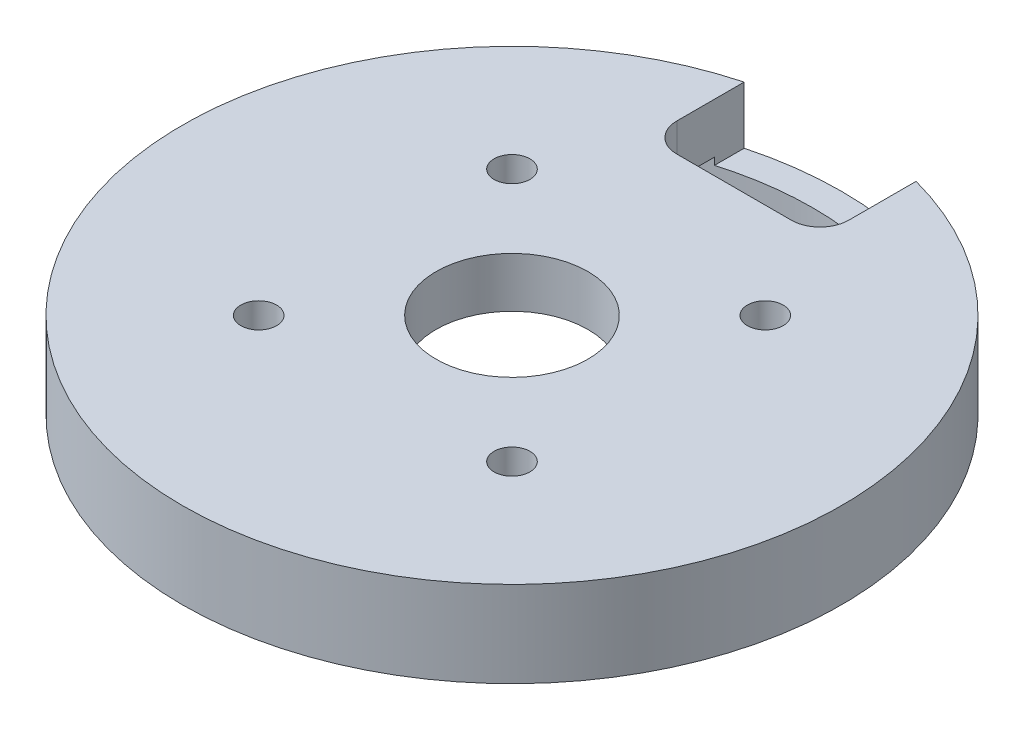
ISO-10303-21;
HEADER;
FILE_DESCRIPTION(('STEP AP214'),'2;1');
FILE_NAME('part.step','',(''),(''),'','','');
FILE_SCHEMA(('AUTOMOTIVE_DESIGN { 1 0 10303 214 1 1 1 1 }'));
ENDSEC;
DATA;
#1=APPLICATION_CONTEXT('core data for automotive mechanical design processes');
#2=APPLICATION_PROTOCOL_DEFINITION('international standard','automotive_design',2000,#1);
#3=PRODUCT_CONTEXT('',#1,'mechanical');
#4=PRODUCT('Part','Part','',(#3));
#5=PRODUCT_RELATED_PRODUCT_CATEGORY('part','',(#4));
#6=PRODUCT_DEFINITION_FORMATION('','',#4);
#7=PRODUCT_DEFINITION_CONTEXT('part definition',#1,'design');
#8=PRODUCT_DEFINITION('design','',#6,#7);
#9=PRODUCT_DEFINITION_SHAPE('','',#8);
#10=(LENGTH_UNIT() NAMED_UNIT(*) SI_UNIT(.MILLI.,.METRE.));
#11=(NAMED_UNIT(*) PLANE_ANGLE_UNIT() SI_UNIT($,.RADIAN.));
#12=(NAMED_UNIT(*) SI_UNIT($,.STERADIAN.) SOLID_ANGLE_UNIT());
#13=UNCERTAINTY_MEASURE_WITH_UNIT(LENGTH_MEASURE(1.E-05),#10,'distance_accuracy_value','');
#14=(GEOMETRIC_REPRESENTATION_CONTEXT(3) GLOBAL_UNCERTAINTY_ASSIGNED_CONTEXT((#13)) GLOBAL_UNIT_ASSIGNED_CONTEXT((#10,
#11,#12)) REPRESENTATION_CONTEXT('',''));
#15=CARTESIAN_POINT('',(0.,0.,0.));
#16=DIRECTION('',(0.,0.,1.));
#17=DIRECTION('',(1.,0.,0.));
#18=AXIS2_PLACEMENT_3D('',#15,#16,#17);
#19=CARTESIAN_POINT('',(0.,6.,0.));
#20=DIRECTION('',(0.,-1.,0.));
#21=DIRECTION('',(0.,0.,-1.));
#22=AXIS2_PLACEMENT_3D('',#19,#20,#21);
#23=CYLINDRICAL_SURFACE('',#22,23.);
#24=CARTESIAN_POINT('',(0.,6.,0.));
#25=DIRECTION('',(0.,1.,0.));
#26=DIRECTION('',(0.,0.,1.));
#27=AXIS2_PLACEMENT_3D('',#24,#25,#26);
#28=CIRCLE('',#27,23.);
#29=CARTESIAN_POINT('',(-6.,6.,-22.2036033111745));
#30=VERTEX_POINT('',#29);
#31=CARTESIAN_POINT('',(6.00000000000001,6.,-22.2036033111745));
#32=VERTEX_POINT('',#31);
#33=EDGE_CURVE('E164',#30,#32,#28,.T.);
#34=ORIENTED_EDGE('',*,*,#33,.F.);
#35=DIRECTION('',(0.,1.,0.));
#36=VECTOR('',#35,1.);
#37=CARTESIAN_POINT('',(-6.,2.,-22.2036033111745));
#38=LINE('',#37,#36);
#39=CARTESIAN_POINT('',(-6.,2.,-22.2036033111745));
#40=VERTEX_POINT('',#39);
#41=EDGE_CURVE('E121',#40,#30,#38,.T.);
#42=ORIENTED_EDGE('',*,*,#41,.F.);
#43=CARTESIAN_POINT('',(0.,2.,0.));
#44=DIRECTION('',(0.,1.,0.));
#45=DIRECTION('',(0.,0.,1.));
#46=AXIS2_PLACEMENT_3D('',#43,#44,#45);
#47=CIRCLE('',#46,23.);
#48=CARTESIAN_POINT('',(6.00000000000001,2.,-22.2036033111745));
#49=VERTEX_POINT('',#48);
#50=EDGE_CURVE('E108',#49,#40,#47,.T.);
#51=ORIENTED_EDGE('',*,*,#50,.F.);
#52=DIRECTION('',(0.,1.,0.));
#53=VECTOR('',#52,1.);
#54=CARTESIAN_POINT('',(6.00000000000001,2.,-22.2036033111745));
#55=LINE('',#54,#53);
#56=EDGE_CURVE('E114',#49,#32,#55,.T.);
#57=ORIENTED_EDGE('',*,*,#56,.T.);
#58=EDGE_LOOP('',(#34,#42,#51,#57));
#59=FACE_BOUND('',#58,.T.);
#60=CARTESIAN_POINT('',(0.,0.,0.));
#61=DIRECTION('',(0.,1.,0.));
#62=DIRECTION('',(0.,0.,1.));
#63=AXIS2_PLACEMENT_3D('',#60,#61,#62);
#64=CIRCLE('',#63,23.);
#65=CARTESIAN_POINT('',(0.,0.,23.));
#66=VERTEX_POINT('',#65);
#67=EDGE_CURVE('E160',#66,#66,#64,.T.);
#68=ORIENTED_EDGE('',*,*,#67,.T.);
#69=EDGE_LOOP('',(#68));
#70=FACE_BOUND('',#69,.T.);
#71=ADVANCED_FACE('F37',(#59,#70),#23,.T.);
#72=CARTESIAN_POINT('',(0.,6.,0.));
#73=DIRECTION('',(0.,1.,0.));
#74=DIRECTION('',(0.,0.,1.));
#75=AXIS2_PLACEMENT_3D('',#72,#73,#74);
#76=PLANE('',#75);
#77=CARTESIAN_POINT('',(-8.83883476483186,6.,-8.83883476483183));
#78=DIRECTION('',(0.,1.,0.));
#79=DIRECTION('',(0.,0.,1.));
#80=AXIS2_PLACEMENT_3D('',#77,#78,#79);
#81=CIRCLE('',#80,1.24999999999999);
#82=CARTESIAN_POINT('',(-8.83883476483186,6.,-7.58883476483184));
#83=VERTEX_POINT('',#82);
#84=EDGE_CURVE('E197',#83,#83,#81,.T.);
#85=ORIENTED_EDGE('',*,*,#84,.F.);
#86=EDGE_LOOP('',(#85));
#87=FACE_BOUND('',#86,.T.);
#88=CARTESIAN_POINT('',(8.83883476483183,6.,-8.83883476483186));
#89=DIRECTION('',(0.,1.,0.));
#90=DIRECTION('',(0.,0.,1.));
#91=AXIS2_PLACEMENT_3D('',#88,#89,#90);
#92=CIRCLE('',#91,1.24999999999999);
#93=CARTESIAN_POINT('',(8.83883476483183,6.,-7.58883476483187));
#94=VERTEX_POINT('',#93);
#95=EDGE_CURVE('E187',#94,#94,#92,.T.);
#96=ORIENTED_EDGE('',*,*,#95,.F.);
#97=EDGE_LOOP('',(#96));
#98=FACE_BOUND('',#97,.T.);
#99=CARTESIAN_POINT('',(8.83883476483186,6.,8.83883476483183));
#100=DIRECTION('',(0.,1.,0.));
#101=DIRECTION('',(0.,0.,1.));
#102=AXIS2_PLACEMENT_3D('',#99,#100,#101);
#103=CIRCLE('',#102,1.24999999999999);
#104=CARTESIAN_POINT('',(8.83883476483186,6.,10.0888347648318));
#105=VERTEX_POINT('',#104);
#106=EDGE_CURVE('E184',#105,#105,#103,.T.);
#107=ORIENTED_EDGE('',*,*,#106,.F.);
#108=EDGE_LOOP('',(#107));
#109=FACE_BOUND('',#108,.T.);
#110=CARTESIAN_POINT('',(-8.83883476483183,6.,8.83883476483186));
#111=DIRECTION('',(0.,1.,0.));
#112=DIRECTION('',(0.,0.,1.));
#113=AXIS2_PLACEMENT_3D('',#110,#111,#112);
#114=CIRCLE('',#113,1.24999999999999);
#115=CARTESIAN_POINT('',(-8.83883476483183,6.,10.0888347648318));
#116=VERTEX_POINT('',#115);
#117=EDGE_CURVE('E181',#116,#116,#114,.T.);
#118=ORIENTED_EDGE('',*,*,#117,.F.);
#119=EDGE_LOOP('',(#118));
#120=FACE_BOUND('',#119,.T.);
#121=DIRECTION('',(0.,0.,1.));
#122=VECTOR('',#121,1.);
#123=CARTESIAN_POINT('',(-6.,6.,-22.2036033111745));
#124=LINE('',#123,#122);
#125=CARTESIAN_POINT('',(-6.,6.,-17.5));
#126=VERTEX_POINT('',#125);
#127=EDGE_CURVE('E133',#30,#126,#124,.T.);
#128=ORIENTED_EDGE('',*,*,#127,.F.);
#129=ORIENTED_EDGE('',*,*,#33,.T.);
#130=DIRECTION('',(0.,0.,-1.));
#131=VECTOR('',#130,1.);
#132=CARTESIAN_POINT('',(6.,6.,-22.2036033111745));
#133=LINE('',#132,#131);
#134=CARTESIAN_POINT('',(6.,6.,-17.5));
#135=VERTEX_POINT('',#134);
#136=EDGE_CURVE('E117',#135,#32,#133,.T.);
#137=ORIENTED_EDGE('',*,*,#136,.F.);
#138=CARTESIAN_POINT('',(4.,6.,-17.5));
#139=DIRECTION('',(0.,1.,0.));
#140=DIRECTION('',(0.,0.,1.));
#141=AXIS2_PLACEMENT_3D('',#138,#139,#140);
#142=CIRCLE('',#141,2.);
#143=CARTESIAN_POINT('',(3.99999999999999,6.,-15.5));
#144=VERTEX_POINT('',#143);
#145=EDGE_CURVE('E53',#144,#135,#142,.T.);
#146=ORIENTED_EDGE('',*,*,#145,.F.);
#147=DIRECTION('',(1.,0.,0.));
#148=VECTOR('',#147,1.);
#149=CARTESIAN_POINT('',(-3.99999999999999,6.,-15.5));
#150=LINE('',#149,#148);
#151=CARTESIAN_POINT('',(-3.99999999999999,6.,-15.5));
#152=VERTEX_POINT('',#151);
#153=EDGE_CURVE('E111',#152,#144,#150,.T.);
#154=ORIENTED_EDGE('',*,*,#153,.F.);
#155=CARTESIAN_POINT('',(-4.,6.,-17.5));
#156=DIRECTION('',(0.,1.,0.));
#157=DIRECTION('',(0.,0.,-1.));
#158=AXIS2_PLACEMENT_3D('',#155,#156,#157);
#159=CIRCLE('',#158,2.);
#160=EDGE_CURVE('E136',#126,#152,#159,.T.);
#161=ORIENTED_EDGE('',*,*,#160,.F.);
#162=EDGE_LOOP('',(#128,#129,#137,#146,#154,#161));
#163=FACE_BOUND('',#162,.T.);
#164=CARTESIAN_POINT('',(0.,6.,0.));
#165=DIRECTION('',(0.,-1.,0.));
#166=DIRECTION('',(0.,0.,-1.));
#167=AXIS2_PLACEMENT_3D('',#164,#165,#166);
#168=CIRCLE('',#167,5.3);
#169=CARTESIAN_POINT('',(0.,6.,-5.3));
#170=VERTEX_POINT('',#169);
#171=EDGE_CURVE('E153',#170,#170,#168,.T.);
#172=ORIENTED_EDGE('',*,*,#171,.T.);
#173=EDGE_LOOP('',(#172));
#174=FACE_BOUND('',#173,.T.);
#175=ADVANCED_FACE('F204',(#87,#98,#109,#120,#163,#174),#76,.T.);
#176=CARTESIAN_POINT('',(0.,0.,0.));
#177=DIRECTION('',(0.,1.,0.));
#178=DIRECTION('',(0.,0.,1.));
#179=AXIS2_PLACEMENT_3D('',#176,#177,#178);
#180=PLANE('',#179);
#181=CARTESIAN_POINT('',(0.,0.,0.));
#182=DIRECTION('',(0.,-1.,0.));
#183=DIRECTION('',(0.,0.,-1.));
#184=AXIS2_PLACEMENT_3D('',#181,#182,#183);
#185=CIRCLE('',#184,21.);
#186=CARTESIAN_POINT('',(0.,0.,-21.));
#187=VERTEX_POINT('',#186);
#188=EDGE_CURVE('E161',#187,#187,#185,.T.);
#189=ORIENTED_EDGE('',*,*,#188,.F.);
#190=EDGE_LOOP('',(#189));
#191=FACE_BOUND('',#190,.T.);
#192=ORIENTED_EDGE('',*,*,#67,.F.);
#193=EDGE_LOOP('',(#192));
#194=FACE_BOUND('',#193,.T.);
#195=ADVANCED_FACE('F207',(#191,#194),#180,.F.);
#196=CARTESIAN_POINT('',(0.,2.5,0.));
#197=DIRECTION('',(0.,-1.,0.));
#198=DIRECTION('',(0.,0.,-1.));
#199=AXIS2_PLACEMENT_3D('',#196,#197,#198);
#200=CYLINDRICAL_SURFACE('',#199,21.);
#201=CARTESIAN_POINT('',(0.,2.,0.));
#202=DIRECTION('',(0.,1.,0.));
#203=DIRECTION('',(0.,0.,1.));
#204=AXIS2_PLACEMENT_3D('',#201,#202,#203);
#205=CIRCLE('',#204,21.);
#206=CARTESIAN_POINT('',(-6.,2.,-20.1246117974981));
#207=VERTEX_POINT('',#206);
#208=CARTESIAN_POINT('',(6.,2.,-20.1246117974981));
#209=VERTEX_POINT('',#208);
#210=EDGE_CURVE('E11',#207,#209,#205,.F.);
#211=ORIENTED_EDGE('',*,*,#210,.F.);
#212=DIRECTION('',(0.,-1.,0.));
#213=VECTOR('',#212,1.);
#214=CARTESIAN_POINT('',(-6.,2.5,-20.1246117974981));
#215=LINE('',#214,#213);
#216=CARTESIAN_POINT('',(-6.,2.5,-20.1246117974981));
#217=VERTEX_POINT('',#216);
#218=EDGE_CURVE('E150',#207,#217,#215,.F.);
#219=ORIENTED_EDGE('',*,*,#218,.T.);
#220=CARTESIAN_POINT('',(0.,2.5,0.));
#221=DIRECTION('',(0.,-1.,0.));
#222=DIRECTION('',(0.,0.,-1.));
#223=AXIS2_PLACEMENT_3D('',#220,#221,#222);
#224=CIRCLE('',#223,21.);
#225=CARTESIAN_POINT('',(6.,2.5,-20.1246117974981));
#226=VERTEX_POINT('',#225);
#227=EDGE_CURVE('E157',#226,#217,#224,.T.);
#228=ORIENTED_EDGE('',*,*,#227,.F.);
#229=DIRECTION('',(0.,-1.,0.));
#230=VECTOR('',#229,1.);
#231=CARTESIAN_POINT('',(6.,2.5,-20.1246117974981));
#232=LINE('',#231,#230);
#233=EDGE_CURVE('E61',#226,#209,#232,.T.);
#234=ORIENTED_EDGE('',*,*,#233,.T.);
#235=EDGE_LOOP('',(#211,#219,#228,#234));
#236=FACE_BOUND('',#235,.T.);
#237=ORIENTED_EDGE('',*,*,#188,.T.);
#238=EDGE_LOOP('',(#237));
#239=FACE_BOUND('',#238,.T.);
#240=ADVANCED_FACE('F226',(#236,#239),#200,.F.);
#241=CARTESIAN_POINT('',(0.,2.5,0.));
#242=DIRECTION('',(0.,-1.,0.));
#243=DIRECTION('',(0.,0.,-1.));
#244=AXIS2_PLACEMENT_3D('',#241,#242,#243);
#245=PLANE('',#244);
#246=CARTESIAN_POINT('',(-8.83883476483186,2.5,-8.83883476483183));
#247=DIRECTION('',(0.,-1.,0.));
#248=DIRECTION('',(0.,0.,-1.));
#249=AXIS2_PLACEMENT_3D('',#246,#247,#248);
#250=CIRCLE('',#249,1.24999999999999);
#251=CARTESIAN_POINT('',(-8.83883476483186,2.5,-10.0888347648318));
#252=VERTEX_POINT('',#251);
#253=EDGE_CURVE('E40',#252,#252,#250,.T.);
#254=ORIENTED_EDGE('',*,*,#253,.F.);
#255=EDGE_LOOP('',(#254));
#256=FACE_BOUND('',#255,.T.);
#257=CARTESIAN_POINT('',(8.83883476483183,2.5,-8.83883476483186));
#258=DIRECTION('',(0.,-1.,0.));
#259=DIRECTION('',(0.,0.,-1.));
#260=AXIS2_PLACEMENT_3D('',#257,#258,#259);
#261=CIRCLE('',#260,1.24999999999999);
#262=CARTESIAN_POINT('',(8.83883476483183,2.5,-10.0888347648319));
#263=VERTEX_POINT('',#262);
#264=EDGE_CURVE('E185',#263,#263,#261,.T.);
#265=ORIENTED_EDGE('',*,*,#264,.F.);
#266=EDGE_LOOP('',(#265));
#267=FACE_BOUND('',#266,.T.);
#268=CARTESIAN_POINT('',(8.83883476483186,2.5,8.83883476483183));
#269=DIRECTION('',(0.,-1.,0.));
#270=DIRECTION('',(0.,0.,-1.));
#271=AXIS2_PLACEMENT_3D('',#268,#269,#270);
#272=CIRCLE('',#271,1.24999999999999);
#273=CARTESIAN_POINT('',(8.83883476483186,2.5,7.58883476483183));
#274=VERTEX_POINT('',#273);
#275=EDGE_CURVE('E182',#274,#274,#272,.T.);
#276=ORIENTED_EDGE('',*,*,#275,.F.);
#277=EDGE_LOOP('',(#276));
#278=FACE_BOUND('',#277,.T.);
#279=CARTESIAN_POINT('',(-8.83883476483183,2.5,8.83883476483186));
#280=DIRECTION('',(0.,-1.,0.));
#281=DIRECTION('',(0.,0.,-1.));
#282=AXIS2_PLACEMENT_3D('',#279,#280,#281);
#283=CIRCLE('',#282,1.24999999999999);
#284=CARTESIAN_POINT('',(-8.83883476483183,2.5,7.58883476483187));
#285=VERTEX_POINT('',#284);
#286=EDGE_CURVE('E131',#285,#285,#283,.T.);
#287=ORIENTED_EDGE('',*,*,#286,.F.);
#288=EDGE_LOOP('',(#287));
#289=FACE_BOUND('',#288,.T.);
#290=DIRECTION('',(0.,0.,-1.));
#291=VECTOR('',#290,1.);
#292=CARTESIAN_POINT('',(-6.,2.5,0.));
#293=LINE('',#292,#291);
#294=CARTESIAN_POINT('',(-6.,2.5,-17.5));
#295=VERTEX_POINT('',#294);
#296=EDGE_CURVE('E45',#295,#217,#293,.T.);
#297=ORIENTED_EDGE('',*,*,#296,.F.);
#298=CARTESIAN_POINT('',(-4.,2.5,-17.5));
#299=DIRECTION('',(0.,-1.,0.));
#300=DIRECTION('',(0.,0.,-1.));
#301=AXIS2_PLACEMENT_3D('',#298,#299,#300);
#302=CIRCLE('',#301,2.);
#303=CARTESIAN_POINT('',(-3.99999999999999,2.5,-15.5));
#304=VERTEX_POINT('',#303);
#305=EDGE_CURVE('E176',#304,#295,#302,.T.);
#306=ORIENTED_EDGE('',*,*,#305,.F.);
#307=DIRECTION('',(-1.,0.,0.));
#308=VECTOR('',#307,1.);
#309=CARTESIAN_POINT('',(0.,2.5,-15.5));
#310=LINE('',#309,#308);
#311=CARTESIAN_POINT('',(3.99999999999999,2.5,-15.5));
#312=VERTEX_POINT('',#311);
#313=EDGE_CURVE('E174',#312,#304,#310,.T.);
#314=ORIENTED_EDGE('',*,*,#313,.F.);
#315=CARTESIAN_POINT('',(4.,2.5,-17.5));
#316=DIRECTION('',(0.,-1.,0.));
#317=DIRECTION('',(0.,0.,-1.));
#318=AXIS2_PLACEMENT_3D('',#315,#316,#317);
#319=CIRCLE('',#318,2.);
#320=CARTESIAN_POINT('',(6.,2.5,-17.5));
#321=VERTEX_POINT('',#320);
#322=EDGE_CURVE('E172',#321,#312,#319,.T.);
#323=ORIENTED_EDGE('',*,*,#322,.F.);
#324=DIRECTION('',(0.,0.,1.));
#325=VECTOR('',#324,1.);
#326=CARTESIAN_POINT('',(6.,2.5,0.));
#327=LINE('',#326,#325);
#328=EDGE_CURVE('E166',#226,#321,#327,.T.);
#329=ORIENTED_EDGE('',*,*,#328,.F.);
#330=ORIENTED_EDGE('',*,*,#227,.T.);
#331=EDGE_LOOP('',(#297,#306,#314,#323,#329,#330));
#332=FACE_BOUND('',#331,.T.);
#333=CARTESIAN_POINT('',(0.,2.5,0.));
#334=DIRECTION('',(0.,-1.,0.));
#335=DIRECTION('',(0.,0.,-1.));
#336=AXIS2_PLACEMENT_3D('',#333,#334,#335);
#337=CIRCLE('',#336,5.3);
#338=CARTESIAN_POINT('',(0.,2.5,-5.3));
#339=VERTEX_POINT('',#338);
#340=EDGE_CURVE('E156',#339,#339,#337,.T.);
#341=ORIENTED_EDGE('',*,*,#340,.F.);
#342=EDGE_LOOP('',(#341));
#343=FACE_BOUND('',#342,.T.);
#344=ADVANCED_FACE('F217',(#256,#267,#278,#289,#332,#343),#245,.T.);
#345=CARTESIAN_POINT('',(0.,6.,0.));
#346=DIRECTION('',(0.,-1.,0.));
#347=DIRECTION('',(0.,0.,-1.));
#348=AXIS2_PLACEMENT_3D('',#345,#346,#347);
#349=CYLINDRICAL_SURFACE('',#348,5.3);
#350=ORIENTED_EDGE('',*,*,#340,.T.);
#351=EDGE_LOOP('',(#350));
#352=FACE_BOUND('',#351,.T.);
#353=ORIENTED_EDGE('',*,*,#171,.F.);
#354=EDGE_LOOP('',(#353));
#355=FACE_BOUND('',#354,.T.);
#356=ADVANCED_FACE('F215',(#352,#355),#349,.F.);
#357=CARTESIAN_POINT('',(4.,2.,-17.5));
#358=DIRECTION('',(0.,1.,0.));
#359=DIRECTION('',(0.,0.,1.));
#360=AXIS2_PLACEMENT_3D('',#357,#358,#359);
#361=PLANE('',#360);
#362=ORIENTED_EDGE('',*,*,#210,.T.);
#363=DIRECTION('',(0.,0.,-1.));
#364=VECTOR('',#363,1.);
#365=CARTESIAN_POINT('',(6.,2.,-22.2036033111745));
#366=LINE('',#365,#364);
#367=EDGE_CURVE('E103',#209,#49,#366,.T.);
#368=ORIENTED_EDGE('',*,*,#367,.T.);
#369=ORIENTED_EDGE('',*,*,#50,.T.);
#370=DIRECTION('',(0.,0.,1.));
#371=VECTOR('',#370,1.);
#372=CARTESIAN_POINT('',(-6.,2.,-22.2036033111745));
#373=LINE('',#372,#371);
#374=EDGE_CURVE('E125',#40,#207,#373,.T.);
#375=ORIENTED_EDGE('',*,*,#374,.T.);
#376=EDGE_LOOP('',(#362,#368,#369,#375));
#377=FACE_BOUND('',#376,.T.);
#378=ADVANCED_FACE('F105',(#377),#361,.T.);
#379=CARTESIAN_POINT('',(-6.,2.,-22.2036033111745));
#380=DIRECTION('',(-1.,0.,0.));
#381=DIRECTION('',(0.,0.,1.));
#382=AXIS2_PLACEMENT_3D('',#379,#380,#381);
#383=PLANE('',#382);
#384=ORIENTED_EDGE('',*,*,#374,.F.);
#385=ORIENTED_EDGE('',*,*,#41,.T.);
#386=ORIENTED_EDGE('',*,*,#127,.T.);
#387=DIRECTION('',(0.,1.,0.));
#388=VECTOR('',#387,1.);
#389=CARTESIAN_POINT('',(-6.,2.,-17.5));
#390=LINE('',#389,#388);
#391=EDGE_CURVE('E145',#295,#126,#390,.T.);
#392=ORIENTED_EDGE('',*,*,#391,.F.);
#393=ORIENTED_EDGE('',*,*,#296,.T.);
#394=ORIENTED_EDGE('',*,*,#218,.F.);
#395=EDGE_LOOP('',(#384,#385,#386,#392,#393,#394));
#396=FACE_BOUND('',#395,.T.);
#397=ADVANCED_FACE('F224',(#396),#383,.F.);
#398=CARTESIAN_POINT('',(6.,2.,-22.2036033111745));
#399=DIRECTION('',(1.,0.,0.));
#400=DIRECTION('',(0.,0.,-1.));
#401=AXIS2_PLACEMENT_3D('',#398,#399,#400);
#402=PLANE('',#401);
#403=ORIENTED_EDGE('',*,*,#328,.T.);
#404=DIRECTION('',(0.,1.,0.));
#405=VECTOR('',#404,1.);
#406=CARTESIAN_POINT('',(6.,2.,-17.5));
#407=LINE('',#406,#405);
#408=EDGE_CURVE('E122',#321,#135,#407,.T.);
#409=ORIENTED_EDGE('',*,*,#408,.T.);
#410=ORIENTED_EDGE('',*,*,#136,.T.);
#411=ORIENTED_EDGE('',*,*,#56,.F.);
#412=ORIENTED_EDGE('',*,*,#367,.F.);
#413=ORIENTED_EDGE('',*,*,#233,.F.);
#414=EDGE_LOOP('',(#403,#409,#410,#411,#412,#413));
#415=FACE_BOUND('',#414,.T.);
#416=ADVANCED_FACE('F115',(#415),#402,.F.);
#417=CARTESIAN_POINT('',(4.,2.,-17.5));
#418=DIRECTION('',(0.,1.,0.));
#419=DIRECTION('',(0.,0.,1.));
#420=AXIS2_PLACEMENT_3D('',#417,#418,#419);
#421=CYLINDRICAL_SURFACE('',#420,2.);
#422=ORIENTED_EDGE('',*,*,#322,.T.);
#423=DIRECTION('',(0.,1.,0.));
#424=VECTOR('',#423,1.);
#425=CARTESIAN_POINT('',(3.99999999999999,2.,-15.5));
#426=LINE('',#425,#424);
#427=EDGE_CURVE('E141',#312,#144,#426,.T.);
#428=ORIENTED_EDGE('',*,*,#427,.T.);
#429=ORIENTED_EDGE('',*,*,#145,.T.);
#430=ORIENTED_EDGE('',*,*,#408,.F.);
#431=EDGE_LOOP('',(#422,#428,#429,#430));
#432=FACE_BOUND('',#431,.T.);
#433=ADVANCED_FACE('F319',(#432),#421,.F.);
#434=CARTESIAN_POINT('',(-3.99999999999999,2.,-15.5));
#435=DIRECTION('',(0.,0.,1.));
#436=DIRECTION('',(1.,0.,0.));
#437=AXIS2_PLACEMENT_3D('',#434,#435,#436);
#438=PLANE('',#437);
#439=ORIENTED_EDGE('',*,*,#313,.T.);
#440=DIRECTION('',(0.,1.,0.));
#441=VECTOR('',#440,1.);
#442=CARTESIAN_POINT('',(-3.99999999999999,2.,-15.5));
#443=LINE('',#442,#441);
#444=EDGE_CURVE('E143',#304,#152,#443,.T.);
#445=ORIENTED_EDGE('',*,*,#444,.T.);
#446=ORIENTED_EDGE('',*,*,#153,.T.);
#447=ORIENTED_EDGE('',*,*,#427,.F.);
#448=EDGE_LOOP('',(#439,#445,#446,#447));
#449=FACE_BOUND('',#448,.T.);
#450=ADVANCED_FACE('F312',(#449),#438,.F.);
#451=CARTESIAN_POINT('',(-4.,2.,-17.5));
#452=DIRECTION('',(0.,1.,0.));
#453=DIRECTION('',(0.,0.,1.));
#454=AXIS2_PLACEMENT_3D('',#451,#452,#453);
#455=CYLINDRICAL_SURFACE('',#454,2.);
#456=ORIENTED_EDGE('',*,*,#305,.T.);
#457=ORIENTED_EDGE('',*,*,#391,.T.);
#458=ORIENTED_EDGE('',*,*,#160,.T.);
#459=ORIENTED_EDGE('',*,*,#444,.F.);
#460=EDGE_LOOP('',(#456,#457,#458,#459));
#461=FACE_BOUND('',#460,.T.);
#462=ADVANCED_FACE('F268',(#461),#455,.F.);
#463=CARTESIAN_POINT('',(-8.83883476483183,6.,8.83883476483186));
#464=DIRECTION('',(0.,1.,0.));
#465=DIRECTION('',(0.,0.,1.));
#466=AXIS2_PLACEMENT_3D('',#463,#464,#465);
#467=CYLINDRICAL_SURFACE('',#466,1.24999999999999);
#468=ORIENTED_EDGE('',*,*,#286,.T.);
#469=EDGE_LOOP('',(#468));
#470=FACE_BOUND('',#469,.T.);
#471=ORIENTED_EDGE('',*,*,#117,.T.);
#472=EDGE_LOOP('',(#471));
#473=FACE_BOUND('',#472,.T.);
#474=ADVANCED_FACE('F202',(#470,#473),#467,.F.);
#475=CARTESIAN_POINT('',(8.83883476483186,6.,8.83883476483183));
#476=DIRECTION('',(0.,1.,0.));
#477=DIRECTION('',(0.,0.,1.));
#478=AXIS2_PLACEMENT_3D('',#475,#476,#477);
#479=CYLINDRICAL_SURFACE('',#478,1.24999999999999);
#480=ORIENTED_EDGE('',*,*,#275,.T.);
#481=EDGE_LOOP('',(#480));
#482=FACE_BOUND('',#481,.T.);
#483=ORIENTED_EDGE('',*,*,#106,.T.);
#484=EDGE_LOOP('',(#483));
#485=FACE_BOUND('',#484,.T.);
#486=ADVANCED_FACE('F267',(#482,#485),#479,.F.);
#487=CARTESIAN_POINT('',(8.83883476483183,6.,-8.83883476483186));
#488=DIRECTION('',(0.,1.,0.));
#489=DIRECTION('',(0.,0.,1.));
#490=AXIS2_PLACEMENT_3D('',#487,#488,#489);
#491=CYLINDRICAL_SURFACE('',#490,1.24999999999999);
#492=ORIENTED_EDGE('',*,*,#264,.T.);
#493=EDGE_LOOP('',(#492));
#494=FACE_BOUND('',#493,.T.);
#495=ORIENTED_EDGE('',*,*,#95,.T.);
#496=EDGE_LOOP('',(#495));
#497=FACE_BOUND('',#496,.T.);
#498=ADVANCED_FACE('F280',(#494,#497),#491,.F.);
#499=CARTESIAN_POINT('',(-8.83883476483186,6.,-8.83883476483183));
#500=DIRECTION('',(0.,1.,0.));
#501=DIRECTION('',(0.,0.,1.));
#502=AXIS2_PLACEMENT_3D('',#499,#500,#501);
#503=CYLINDRICAL_SURFACE('',#502,1.24999999999999);
#504=ORIENTED_EDGE('',*,*,#253,.T.);
#505=EDGE_LOOP('',(#504));
#506=FACE_BOUND('',#505,.T.);
#507=ORIENTED_EDGE('',*,*,#84,.T.);
#508=EDGE_LOOP('',(#507));
#509=FACE_BOUND('',#508,.T.);
#510=ADVANCED_FACE('F291',(#506,#509),#503,.F.);
#511=CLOSED_SHELL('',(#71,#175,#195,#240,#344,#356,#378,#397,#416,#433,#450,#462,#474,#486,#498,#510));
#512=MANIFOLD_SOLID_BREP('B2',#511);
#513=ADVANCED_BREP_SHAPE_REPRESENTATION('',(#18,#512),#14);
#514=SHAPE_DEFINITION_REPRESENTATION(#9,#513);
ENDSEC;
END-ISO-10303-21;
